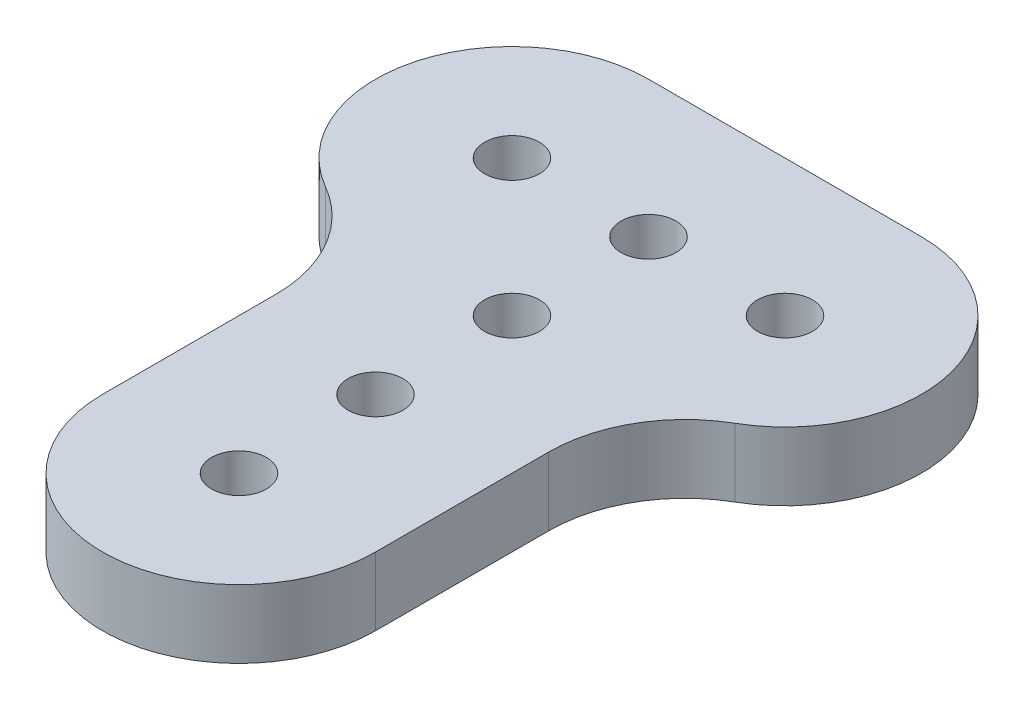
ISO-10303-21;
HEADER;
FILE_DESCRIPTION(('STEP AP214'),'2;1');
FILE_NAME('part.step','',(''),(''),'','','');
FILE_SCHEMA(('AUTOMOTIVE_DESIGN { 1 0 10303 214 1 1 1 1 }'));
ENDSEC;
DATA;
#1=APPLICATION_CONTEXT('core data for automotive mechanical design processes');
#2=APPLICATION_PROTOCOL_DEFINITION('international standard','automotive_design',2000,#1);
#3=PRODUCT_CONTEXT('',#1,'mechanical');
#4=PRODUCT('Part','Part','',(#3));
#5=PRODUCT_RELATED_PRODUCT_CATEGORY('part','',(#4));
#6=PRODUCT_DEFINITION_FORMATION('','',#4);
#7=PRODUCT_DEFINITION_CONTEXT('part definition',#1,'design');
#8=PRODUCT_DEFINITION('design','',#6,#7);
#9=PRODUCT_DEFINITION_SHAPE('','',#8);
#10=(LENGTH_UNIT() NAMED_UNIT(*) SI_UNIT(.MILLI.,.METRE.));
#11=(NAMED_UNIT(*) PLANE_ANGLE_UNIT() SI_UNIT($,.RADIAN.));
#12=(NAMED_UNIT(*) SI_UNIT($,.STERADIAN.) SOLID_ANGLE_UNIT());
#13=UNCERTAINTY_MEASURE_WITH_UNIT(LENGTH_MEASURE(1.E-05),#10,'distance_accuracy_value','');
#14=(GEOMETRIC_REPRESENTATION_CONTEXT(3) GLOBAL_UNCERTAINTY_ASSIGNED_CONTEXT((#13)) GLOBAL_UNIT_ASSIGNED_CONTEXT((#10,
#11,#12)) REPRESENTATION_CONTEXT('',''));
#15=CARTESIAN_POINT('',(0.,0.,0.));
#16=DIRECTION('',(0.,0.,1.));
#17=DIRECTION('',(1.,0.,0.));
#18=AXIS2_PLACEMENT_3D('',#15,#16,#17);
#19=CARTESIAN_POINT('',(38.1,3.175,0.));
#20=DIRECTION('',(0.,-1.,0.));
#21=DIRECTION('',(0.,0.,-1.));
#22=AXIS2_PLACEMENT_3D('',#19,#20,#21);
#23=CYLINDRICAL_SURFACE('',#22,12.7);
#24=CARTESIAN_POINT('',(38.1,3.175,0.));
#25=DIRECTION('',(0.,1.,0.));
#26=DIRECTION('',(0.,0.,1.));
#27=AXIS2_PLACEMENT_3D('',#24,#25,#26);
#28=CIRCLE('',#27,12.7);
#29=CARTESIAN_POINT('',(44.45,3.175,10.9985226280624));
#30=VERTEX_POINT('',#29);
#31=CARTESIAN_POINT('',(38.1,3.175,-12.7));
#32=VERTEX_POINT('',#31);
#33=EDGE_CURVE('E102',#30,#32,#28,.T.);
#34=ORIENTED_EDGE('',*,*,#33,.F.);
#35=DIRECTION('',(0.,-1.,0.));
#36=VECTOR('',#35,1.);
#37=CARTESIAN_POINT('',(44.45,3.175,10.9985226280624));
#38=LINE('',#37,#36);
#39=CARTESIAN_POINT('',(44.45,-3.175,10.9985226280624));
#40=VERTEX_POINT('',#39);
#41=EDGE_CURVE('E195',#30,#40,#38,.T.);
#42=ORIENTED_EDGE('',*,*,#41,.T.);
#43=CARTESIAN_POINT('',(38.1,-3.175,0.));
#44=DIRECTION('',(0.,1.,0.));
#45=DIRECTION('',(0.,0.,1.));
#46=AXIS2_PLACEMENT_3D('',#43,#44,#45);
#47=CIRCLE('',#46,12.7);
#48=CARTESIAN_POINT('',(38.1,-3.175,-12.7));
#49=VERTEX_POINT('',#48);
#50=EDGE_CURVE('E117',#40,#49,#47,.T.);
#51=ORIENTED_EDGE('',*,*,#50,.T.);
#52=DIRECTION('',(0.,-1.,0.));
#53=VECTOR('',#52,1.);
#54=CARTESIAN_POINT('',(38.1,3.175,-12.7));
#55=LINE('',#54,#53);
#56=EDGE_CURVE('E116',#32,#49,#55,.T.);
#57=ORIENTED_EDGE('',*,*,#56,.F.);
#58=EDGE_LOOP('',(#34,#42,#51,#57));
#59=FACE_BOUND('',#58,.T.);
#60=ADVANCED_FACE('F37',(#59),#23,.T.);
#61=CARTESIAN_POINT('',(0.,3.175,-12.7));
#62=DIRECTION('',(0.,0.,-1.));
#63=DIRECTION('',(-1.,0.,0.));
#64=AXIS2_PLACEMENT_3D('',#61,#62,#63);
#65=PLANE('',#64);
#66=DIRECTION('',(1.,0.,0.));
#67=VECTOR('',#66,1.);
#68=CARTESIAN_POINT('',(0.,-3.175,-12.7));
#69=LINE('',#68,#67);
#70=CARTESIAN_POINT('',(12.7,-3.175,-12.7));
#71=VERTEX_POINT('',#70);
#72=EDGE_CURVE('E157',#71,#49,#69,.T.);
#73=ORIENTED_EDGE('',*,*,#72,.F.);
#74=DIRECTION('',(0.,-1.,0.));
#75=VECTOR('',#74,1.);
#76=CARTESIAN_POINT('',(12.7,3.175,-12.7));
#77=LINE('',#76,#75);
#78=CARTESIAN_POINT('',(12.7,3.175,-12.7));
#79=VERTEX_POINT('',#78);
#80=EDGE_CURVE('E122',#79,#71,#77,.T.);
#81=ORIENTED_EDGE('',*,*,#80,.F.);
#82=DIRECTION('',(1.,0.,0.));
#83=VECTOR('',#82,1.);
#84=CARTESIAN_POINT('',(0.,3.175,-12.7));
#85=LINE('',#84,#83);
#86=EDGE_CURVE('E108',#79,#32,#85,.T.);
#87=ORIENTED_EDGE('',*,*,#86,.T.);
#88=ORIENTED_EDGE('',*,*,#56,.T.);
#89=EDGE_LOOP('',(#73,#81,#87,#88));
#90=FACE_BOUND('',#89,.T.);
#91=ADVANCED_FACE('F124',(#90),#65,.T.);
#92=CARTESIAN_POINT('',(12.7,3.175,0.));
#93=DIRECTION('',(0.,-1.,0.));
#94=DIRECTION('',(0.,0.,-1.));
#95=AXIS2_PLACEMENT_3D('',#92,#93,#94);
#96=CYLINDRICAL_SURFACE('',#95,12.7);
#97=CARTESIAN_POINT('',(12.7,-3.175,0.));
#98=DIRECTION('',(0.,1.,0.));
#99=DIRECTION('',(0.,0.,1.));
#100=AXIS2_PLACEMENT_3D('',#97,#98,#99);
#101=CIRCLE('',#100,12.7);
#102=CARTESIAN_POINT('',(6.35,-3.175,10.9985226280624));
#103=VERTEX_POINT('',#102);
#104=EDGE_CURVE('E159',#71,#103,#101,.T.);
#105=ORIENTED_EDGE('',*,*,#104,.T.);
#106=DIRECTION('',(0.,-1.,0.));
#107=VECTOR('',#106,1.);
#108=CARTESIAN_POINT('',(6.35,3.175,10.9985226280624));
#109=LINE('',#108,#107);
#110=CARTESIAN_POINT('',(6.35,3.175,10.9985226280624));
#111=VERTEX_POINT('',#110);
#112=EDGE_CURVE('E193',#103,#111,#109,.F.);
#113=ORIENTED_EDGE('',*,*,#112,.T.);
#114=CARTESIAN_POINT('',(12.7,3.175,0.));
#115=DIRECTION('',(0.,1.,0.));
#116=DIRECTION('',(0.,0.,1.));
#117=AXIS2_PLACEMENT_3D('',#114,#115,#116);
#118=CIRCLE('',#117,12.7);
#119=EDGE_CURVE('E126',#79,#111,#118,.T.);
#120=ORIENTED_EDGE('',*,*,#119,.F.);
#121=ORIENTED_EDGE('',*,*,#80,.T.);
#122=EDGE_LOOP('',(#105,#113,#120,#121));
#123=FACE_BOUND('',#122,.T.);
#124=ADVANCED_FACE('F216',(#123),#96,.T.);
#125=CARTESIAN_POINT('',(12.7,3.175,0.));
#126=DIRECTION('',(-1.,0.,0.));
#127=DIRECTION('',(0.,0.,1.));
#128=AXIS2_PLACEMENT_3D('',#125,#126,#127);
#129=PLANE('',#128);
#130=DIRECTION('',(0.,0.,-1.));
#131=VECTOR('',#130,1.);
#132=CARTESIAN_POINT('',(12.7,3.175,0.));
#133=LINE('',#132,#131);
#134=CARTESIAN_POINT('',(12.7,3.175,38.1));
#135=VERTEX_POINT('',#134);
#136=CARTESIAN_POINT('',(12.7,3.175,21.9970452561247));
#137=VERTEX_POINT('',#136);
#138=EDGE_CURVE('E128',#135,#137,#133,.T.);
#139=ORIENTED_EDGE('',*,*,#138,.T.);
#140=DIRECTION('',(0.,-1.,0.));
#141=VECTOR('',#140,1.);
#142=CARTESIAN_POINT('',(12.7,3.175,21.9970452561247));
#143=LINE('',#142,#141);
#144=CARTESIAN_POINT('',(12.7,-3.175,21.9970452561247));
#145=VERTEX_POINT('',#144);
#146=EDGE_CURVE('E121',#137,#145,#143,.T.);
#147=ORIENTED_EDGE('',*,*,#146,.T.);
#148=DIRECTION('',(0.,0.,-1.));
#149=VECTOR('',#148,1.);
#150=CARTESIAN_POINT('',(12.7,-3.175,0.));
#151=LINE('',#150,#149);
#152=CARTESIAN_POINT('',(12.7,-3.175,38.1));
#153=VERTEX_POINT('',#152);
#154=EDGE_CURVE('E162',#153,#145,#151,.T.);
#155=ORIENTED_EDGE('',*,*,#154,.F.);
#156=DIRECTION('',(0.,-1.,0.));
#157=VECTOR('',#156,1.);
#158=CARTESIAN_POINT('',(12.7,3.175,38.1));
#159=LINE('',#158,#157);
#160=EDGE_CURVE('E188',#135,#153,#159,.T.);
#161=ORIENTED_EDGE('',*,*,#160,.F.);
#162=EDGE_LOOP('',(#139,#147,#155,#161));
#163=FACE_BOUND('',#162,.T.);
#164=ADVANCED_FACE('F207',(#163),#129,.T.);
#165=CARTESIAN_POINT('',(25.4000000000005,3.175,38.1));
#166=DIRECTION('',(0.,-1.,0.));
#167=DIRECTION('',(0.,0.,-1.));
#168=AXIS2_PLACEMENT_3D('',#165,#166,#167);
#169=CYLINDRICAL_SURFACE('',#168,12.7);
#170=CARTESIAN_POINT('',(25.4000000000005,-3.175,38.1));
#171=DIRECTION('',(0.,1.,0.));
#172=DIRECTION('',(0.,0.,1.));
#173=AXIS2_PLACEMENT_3D('',#170,#171,#172);
#174=CIRCLE('',#173,12.7);
#175=CARTESIAN_POINT('',(38.1,-3.175,38.1));
#176=VERTEX_POINT('',#175);
#177=EDGE_CURVE('E165',#153,#176,#174,.T.);
#178=ORIENTED_EDGE('',*,*,#177,.T.);
#179=DIRECTION('',(0.,-1.,0.));
#180=VECTOR('',#179,1.);
#181=CARTESIAN_POINT('',(38.1,3.175,38.1));
#182=LINE('',#181,#180);
#183=CARTESIAN_POINT('',(38.1,3.175,38.1));
#184=VERTEX_POINT('',#183);
#185=EDGE_CURVE('E155',#184,#176,#182,.T.);
#186=ORIENTED_EDGE('',*,*,#185,.F.);
#187=CARTESIAN_POINT('',(25.4000000000005,3.175,38.1));
#188=DIRECTION('',(0.,1.,0.));
#189=DIRECTION('',(0.,0.,1.));
#190=AXIS2_PLACEMENT_3D('',#187,#188,#189);
#191=CIRCLE('',#190,12.7);
#192=EDGE_CURVE('E133',#135,#184,#191,.T.);
#193=ORIENTED_EDGE('',*,*,#192,.F.);
#194=ORIENTED_EDGE('',*,*,#160,.T.);
#195=EDGE_LOOP('',(#178,#186,#193,#194));
#196=FACE_BOUND('',#195,.T.);
#197=ADVANCED_FACE('F223',(#196),#169,.T.);
#198=CARTESIAN_POINT('',(25.4000000000003,3.175,25.4));
#199=DIRECTION('',(0.,-1.,0.));
#200=DIRECTION('',(0.,0.,-1.));
#201=AXIS2_PLACEMENT_3D('',#198,#199,#200);
#202=CYLINDRICAL_SURFACE('',#201,2.5527);
#203=CARTESIAN_POINT('',(25.4000000000003,3.175,25.4));
#204=DIRECTION('',(0.,1.,0.));
#205=DIRECTION('',(0.,0.,1.));
#206=AXIS2_PLACEMENT_3D('',#203,#204,#205);
#207=CIRCLE('',#206,2.5527);
#208=CARTESIAN_POINT('',(25.4000000000003,3.175,27.9527));
#209=VERTEX_POINT('',#208);
#210=EDGE_CURVE('E149',#209,#209,#207,.T.);
#211=ORIENTED_EDGE('',*,*,#210,.T.);
#212=EDGE_LOOP('',(#211));
#213=FACE_BOUND('',#212,.T.);
#214=CARTESIAN_POINT('',(25.4000000000003,-3.175,25.4));
#215=DIRECTION('',(0.,1.,0.));
#216=DIRECTION('',(0.,0.,1.));
#217=AXIS2_PLACEMENT_3D('',#214,#215,#216);
#218=CIRCLE('',#217,2.5527);
#219=CARTESIAN_POINT('',(25.4000000000003,-3.175,27.9527));
#220=VERTEX_POINT('',#219);
#221=EDGE_CURVE('E181',#220,#220,#218,.T.);
#222=ORIENTED_EDGE('',*,*,#221,.F.);
#223=EDGE_LOOP('',(#222));
#224=FACE_BOUND('',#223,.T.);
#225=ADVANCED_FACE('F247',(#213,#224),#202,.F.);
#226=CARTESIAN_POINT('',(25.4,3.175,0.));
#227=DIRECTION('',(0.,-1.,0.));
#228=DIRECTION('',(0.,0.,-1.));
#229=AXIS2_PLACEMENT_3D('',#226,#227,#228);
#230=CYLINDRICAL_SURFACE('',#229,2.5527);
#231=CARTESIAN_POINT('',(25.4,3.175,0.));
#232=DIRECTION('',(0.,1.,0.));
#233=DIRECTION('',(0.,0.,1.));
#234=AXIS2_PLACEMENT_3D('',#231,#232,#233);
#235=CIRCLE('',#234,2.5527);
#236=CARTESIAN_POINT('',(25.4,3.175,2.5527));
#237=VERTEX_POINT('',#236);
#238=EDGE_CURVE('E146',#237,#237,#235,.T.);
#239=ORIENTED_EDGE('',*,*,#238,.T.);
#240=EDGE_LOOP('',(#239));
#241=FACE_BOUND('',#240,.T.);
#242=CARTESIAN_POINT('',(25.4,-3.175,0.));
#243=DIRECTION('',(0.,1.,0.));
#244=DIRECTION('',(0.,0.,1.));
#245=AXIS2_PLACEMENT_3D('',#242,#243,#244);
#246=CIRCLE('',#245,2.5527);
#247=CARTESIAN_POINT('',(25.4,-3.175,2.5527));
#248=VERTEX_POINT('',#247);
#249=EDGE_CURVE('E178',#248,#248,#246,.T.);
#250=ORIENTED_EDGE('',*,*,#249,.F.);
#251=EDGE_LOOP('',(#250));
#252=FACE_BOUND('',#251,.T.);
#253=ADVANCED_FACE('F250',(#241,#252),#230,.F.);
#254=CARTESIAN_POINT('',(38.1,3.175,0.));
#255=DIRECTION('',(0.,-1.,0.));
#256=DIRECTION('',(0.,0.,-1.));
#257=AXIS2_PLACEMENT_3D('',#254,#255,#256);
#258=CYLINDRICAL_SURFACE('',#257,2.5527);
#259=CARTESIAN_POINT('',(38.1,3.175,0.));
#260=DIRECTION('',(0.,1.,0.));
#261=DIRECTION('',(0.,0.,1.));
#262=AXIS2_PLACEMENT_3D('',#259,#260,#261);
#263=CIRCLE('',#262,2.5527);
#264=CARTESIAN_POINT('',(38.1,3.175,2.5527));
#265=VERTEX_POINT('',#264);
#266=EDGE_CURVE('E143',#265,#265,#263,.T.);
#267=ORIENTED_EDGE('',*,*,#266,.T.);
#268=EDGE_LOOP('',(#267));
#269=FACE_BOUND('',#268,.T.);
#270=CARTESIAN_POINT('',(38.1,-3.175,0.));
#271=DIRECTION('',(0.,1.,0.));
#272=DIRECTION('',(0.,0.,1.));
#273=AXIS2_PLACEMENT_3D('',#270,#271,#272);
#274=CIRCLE('',#273,2.5527);
#275=CARTESIAN_POINT('',(38.1,-3.175,2.5527));
#276=VERTEX_POINT('',#275);
#277=EDGE_CURVE('E175',#276,#276,#274,.T.);
#278=ORIENTED_EDGE('',*,*,#277,.F.);
#279=EDGE_LOOP('',(#278));
#280=FACE_BOUND('',#279,.T.);
#281=ADVANCED_FACE('F254',(#269,#280),#258,.F.);
#282=CARTESIAN_POINT('',(12.7,3.175,0.));
#283=DIRECTION('',(0.,-1.,0.));
#284=DIRECTION('',(0.,0.,-1.));
#285=AXIS2_PLACEMENT_3D('',#282,#283,#284);
#286=CYLINDRICAL_SURFACE('',#285,2.5527);
#287=CARTESIAN_POINT('',(12.7,3.175,0.));
#288=DIRECTION('',(0.,1.,0.));
#289=DIRECTION('',(0.,0.,1.));
#290=AXIS2_PLACEMENT_3D('',#287,#288,#289);
#291=CIRCLE('',#290,2.5527);
#292=CARTESIAN_POINT('',(12.7,3.175,2.5527));
#293=VERTEX_POINT('',#292);
#294=EDGE_CURVE('E140',#293,#293,#291,.T.);
#295=ORIENTED_EDGE('',*,*,#294,.T.);
#296=EDGE_LOOP('',(#295));
#297=FACE_BOUND('',#296,.T.);
#298=CARTESIAN_POINT('',(12.7,-3.175,0.));
#299=DIRECTION('',(0.,1.,0.));
#300=DIRECTION('',(0.,0.,1.));
#301=AXIS2_PLACEMENT_3D('',#298,#299,#300);
#302=CIRCLE('',#301,2.5527);
#303=CARTESIAN_POINT('',(12.7,-3.175,2.5527));
#304=VERTEX_POINT('',#303);
#305=EDGE_CURVE('E172',#304,#304,#302,.T.);
#306=ORIENTED_EDGE('',*,*,#305,.F.);
#307=EDGE_LOOP('',(#306));
#308=FACE_BOUND('',#307,.T.);
#309=ADVANCED_FACE('F258',(#297,#308),#286,.F.);
#310=CARTESIAN_POINT('',(25.4000000000001,3.175,12.7));
#311=DIRECTION('',(0.,-1.,0.));
#312=DIRECTION('',(0.,0.,-1.));
#313=AXIS2_PLACEMENT_3D('',#310,#311,#312);
#314=CYLINDRICAL_SURFACE('',#313,2.5527);
#315=CARTESIAN_POINT('',(25.4000000000001,3.175,12.7));
#316=DIRECTION('',(0.,1.,0.));
#317=DIRECTION('',(0.,0.,1.));
#318=AXIS2_PLACEMENT_3D('',#315,#316,#317);
#319=CIRCLE('',#318,2.5527);
#320=CARTESIAN_POINT('',(25.4000000000001,3.175,15.2527));
#321=VERTEX_POINT('',#320);
#322=EDGE_CURVE('E137',#321,#321,#319,.T.);
#323=ORIENTED_EDGE('',*,*,#322,.T.);
#324=EDGE_LOOP('',(#323));
#325=FACE_BOUND('',#324,.T.);
#326=CARTESIAN_POINT('',(25.4000000000001,-3.175,12.7));
#327=DIRECTION('',(0.,1.,0.));
#328=DIRECTION('',(0.,0.,1.));
#329=AXIS2_PLACEMENT_3D('',#326,#327,#328);
#330=CIRCLE('',#329,2.5527);
#331=CARTESIAN_POINT('',(25.4000000000001,-3.175,15.2527));
#332=VERTEX_POINT('',#331);
#333=EDGE_CURVE('E169',#332,#332,#330,.T.);
#334=ORIENTED_EDGE('',*,*,#333,.F.);
#335=EDGE_LOOP('',(#334));
#336=FACE_BOUND('',#335,.T.);
#337=ADVANCED_FACE('F262',(#325,#336),#314,.F.);
#338=CARTESIAN_POINT('',(38.1,3.175,0.));
#339=DIRECTION('',(-1.,0.,0.));
#340=DIRECTION('',(0.,0.,1.));
#341=AXIS2_PLACEMENT_3D('',#338,#339,#340);
#342=PLANE('',#341);
#343=DIRECTION('',(0.,0.,-1.));
#344=VECTOR('',#343,1.);
#345=CARTESIAN_POINT('',(38.1,-3.175,0.));
#346=LINE('',#345,#344);
#347=CARTESIAN_POINT('',(38.1,-3.175,21.9970452561247));
#348=VERTEX_POINT('',#347);
#349=EDGE_CURVE('E167',#176,#348,#346,.T.);
#350=ORIENTED_EDGE('',*,*,#349,.T.);
#351=DIRECTION('',(0.,1.,0.));
#352=VECTOR('',#351,1.);
#353=CARTESIAN_POINT('',(38.1,3.175,21.9970452561247));
#354=LINE('',#353,#352);
#355=CARTESIAN_POINT('',(38.1,3.175,21.9970452561247));
#356=VERTEX_POINT('',#355);
#357=EDGE_CURVE('E52',#348,#356,#354,.T.);
#358=ORIENTED_EDGE('',*,*,#357,.T.);
#359=DIRECTION('',(0.,0.,-1.));
#360=VECTOR('',#359,1.);
#361=CARTESIAN_POINT('',(38.1,3.175,0.));
#362=LINE('',#361,#360);
#363=EDGE_CURVE('E135',#184,#356,#362,.T.);
#364=ORIENTED_EDGE('',*,*,#363,.F.);
#365=ORIENTED_EDGE('',*,*,#185,.T.);
#366=EDGE_LOOP('',(#350,#358,#364,#365));
#367=FACE_BOUND('',#366,.T.);
#368=ADVANCED_FACE('F245',(#367),#342,.F.);
#369=CARTESIAN_POINT('',(25.4000000000004,3.175,38.1));
#370=DIRECTION('',(0.,-1.,0.));
#371=DIRECTION('',(0.,0.,-1.));
#372=AXIS2_PLACEMENT_3D('',#369,#370,#371);
#373=CYLINDRICAL_SURFACE('',#372,2.5527);
#374=CARTESIAN_POINT('',(25.4000000000004,3.175,38.1));
#375=DIRECTION('',(0.,1.,0.));
#376=DIRECTION('',(0.,0.,1.));
#377=AXIS2_PLACEMENT_3D('',#374,#375,#376);
#378=CIRCLE('',#377,2.5527);
#379=CARTESIAN_POINT('',(25.4000000000004,3.175,40.6527));
#380=VERTEX_POINT('',#379);
#381=EDGE_CURVE('E152',#380,#380,#378,.T.);
#382=ORIENTED_EDGE('',*,*,#381,.T.);
#383=EDGE_LOOP('',(#382));
#384=FACE_BOUND('',#383,.T.);
#385=CARTESIAN_POINT('',(25.4000000000004,-3.175,38.1));
#386=DIRECTION('',(0.,1.,0.));
#387=DIRECTION('',(0.,0.,1.));
#388=AXIS2_PLACEMENT_3D('',#385,#386,#387);
#389=CIRCLE('',#388,2.5527);
#390=CARTESIAN_POINT('',(25.4000000000004,-3.175,40.6527));
#391=VERTEX_POINT('',#390);
#392=EDGE_CURVE('E113',#391,#391,#389,.T.);
#393=ORIENTED_EDGE('',*,*,#392,.F.);
#394=EDGE_LOOP('',(#393));
#395=FACE_BOUND('',#394,.T.);
#396=ADVANCED_FACE('F240',(#384,#395),#373,.F.);
#397=CARTESIAN_POINT('',(0.,3.175,0.));
#398=DIRECTION('',(0.,1.,0.));
#399=DIRECTION('',(0.,0.,1.));
#400=AXIS2_PLACEMENT_3D('',#397,#398,#399);
#401=PLANE('',#400);
#402=ORIENTED_EDGE('',*,*,#363,.T.);
#403=CARTESIAN_POINT('',(50.8,3.175,21.9970452561247));
#404=DIRECTION('',(0.,1.,0.));
#405=DIRECTION('',(0.,0.,1.));
#406=AXIS2_PLACEMENT_3D('',#403,#404,#405);
#407=CIRCLE('',#406,12.7);
#408=EDGE_CURVE('E11',#356,#30,#407,.F.);
#409=ORIENTED_EDGE('',*,*,#408,.T.);
#410=ORIENTED_EDGE('',*,*,#33,.T.);
#411=ORIENTED_EDGE('',*,*,#86,.F.);
#412=ORIENTED_EDGE('',*,*,#119,.T.);
#413=CARTESIAN_POINT('',(0.,3.175,21.9970452561247));
#414=DIRECTION('',(0.,1.,0.));
#415=DIRECTION('',(0.,0.,1.));
#416=AXIS2_PLACEMENT_3D('',#413,#414,#415);
#417=CIRCLE('',#416,12.7);
#418=EDGE_CURVE('E200',#111,#137,#417,.F.);
#419=ORIENTED_EDGE('',*,*,#418,.T.);
#420=ORIENTED_EDGE('',*,*,#138,.F.);
#421=ORIENTED_EDGE('',*,*,#192,.T.);
#422=EDGE_LOOP('',(#402,#409,#410,#411,#412,#419,#420,#421));
#423=FACE_BOUND('',#422,.T.);
#424=ORIENTED_EDGE('',*,*,#322,.F.);
#425=EDGE_LOOP('',(#424));
#426=FACE_BOUND('',#425,.T.);
#427=ORIENTED_EDGE('',*,*,#294,.F.);
#428=EDGE_LOOP('',(#427));
#429=FACE_BOUND('',#428,.T.);
#430=ORIENTED_EDGE('',*,*,#266,.F.);
#431=EDGE_LOOP('',(#430));
#432=FACE_BOUND('',#431,.T.);
#433=ORIENTED_EDGE('',*,*,#238,.F.);
#434=EDGE_LOOP('',(#433));
#435=FACE_BOUND('',#434,.T.);
#436=ORIENTED_EDGE('',*,*,#210,.F.);
#437=EDGE_LOOP('',(#436));
#438=FACE_BOUND('',#437,.T.);
#439=ORIENTED_EDGE('',*,*,#381,.F.);
#440=EDGE_LOOP('',(#439));
#441=FACE_BOUND('',#440,.T.);
#442=ADVANCED_FACE('F104',(#423,#426,#429,#432,#435,#438,#441),#401,.T.);
#443=CARTESIAN_POINT('',(0.,-3.175,0.));
#444=DIRECTION('',(0.,1.,0.));
#445=DIRECTION('',(0.,0.,1.));
#446=AXIS2_PLACEMENT_3D('',#443,#444,#445);
#447=PLANE('',#446);
#448=ORIENTED_EDGE('',*,*,#50,.F.);
#449=CARTESIAN_POINT('',(50.8,-3.175,21.9970452561247));
#450=DIRECTION('',(0.,1.,0.));
#451=DIRECTION('',(0.,0.,1.));
#452=AXIS2_PLACEMENT_3D('',#449,#450,#451);
#453=CIRCLE('',#452,12.7);
#454=EDGE_CURVE('E45',#40,#348,#453,.T.);
#455=ORIENTED_EDGE('',*,*,#454,.T.);
#456=ORIENTED_EDGE('',*,*,#349,.F.);
#457=ORIENTED_EDGE('',*,*,#177,.F.);
#458=ORIENTED_EDGE('',*,*,#154,.T.);
#459=CARTESIAN_POINT('',(0.,-3.175,21.9970452561247));
#460=DIRECTION('',(0.,1.,0.));
#461=DIRECTION('',(0.,0.,1.));
#462=AXIS2_PLACEMENT_3D('',#459,#460,#461);
#463=CIRCLE('',#462,12.7);
#464=EDGE_CURVE('E198',#145,#103,#463,.T.);
#465=ORIENTED_EDGE('',*,*,#464,.T.);
#466=ORIENTED_EDGE('',*,*,#104,.F.);
#467=ORIENTED_EDGE('',*,*,#72,.T.);
#468=EDGE_LOOP('',(#448,#455,#456,#457,#458,#465,#466,#467));
#469=FACE_BOUND('',#468,.T.);
#470=ORIENTED_EDGE('',*,*,#333,.T.);
#471=EDGE_LOOP('',(#470));
#472=FACE_BOUND('',#471,.T.);
#473=ORIENTED_EDGE('',*,*,#305,.T.);
#474=EDGE_LOOP('',(#473));
#475=FACE_BOUND('',#474,.T.);
#476=ORIENTED_EDGE('',*,*,#277,.T.);
#477=EDGE_LOOP('',(#476));
#478=FACE_BOUND('',#477,.T.);
#479=ORIENTED_EDGE('',*,*,#249,.T.);
#480=EDGE_LOOP('',(#479));
#481=FACE_BOUND('',#480,.T.);
#482=ORIENTED_EDGE('',*,*,#221,.T.);
#483=EDGE_LOOP('',(#482));
#484=FACE_BOUND('',#483,.T.);
#485=ORIENTED_EDGE('',*,*,#392,.T.);
#486=EDGE_LOOP('',(#485));
#487=FACE_BOUND('',#486,.T.);
#488=ADVANCED_FACE('F212',(#469,#472,#475,#478,#481,#484,#487),#447,.F.);
#489=CARTESIAN_POINT('',(0.,3.175,21.9970452561247));
#490=DIRECTION('',(0.,-1.,0.));
#491=DIRECTION('',(0.,0.,-1.));
#492=AXIS2_PLACEMENT_3D('',#489,#490,#491);
#493=CYLINDRICAL_SURFACE('',#492,12.7);
#494=ORIENTED_EDGE('',*,*,#418,.F.);
#495=ORIENTED_EDGE('',*,*,#112,.F.);
#496=ORIENTED_EDGE('',*,*,#464,.F.);
#497=ORIENTED_EDGE('',*,*,#146,.F.);
#498=EDGE_LOOP('',(#494,#495,#496,#497));
#499=FACE_BOUND('',#498,.T.);
#500=ADVANCED_FACE('F210',(#499),#493,.F.);
#501=CARTESIAN_POINT('',(50.8,3.175,21.9970452561247));
#502=DIRECTION('',(0.,-1.,0.));
#503=DIRECTION('',(0.,0.,-1.));
#504=AXIS2_PLACEMENT_3D('',#501,#502,#503);
#505=CYLINDRICAL_SURFACE('',#504,12.7);
#506=ORIENTED_EDGE('',*,*,#408,.F.);
#507=ORIENTED_EDGE('',*,*,#357,.F.);
#508=ORIENTED_EDGE('',*,*,#454,.F.);
#509=ORIENTED_EDGE('',*,*,#41,.F.);
#510=EDGE_LOOP('',(#506,#507,#508,#509));
#511=FACE_BOUND('',#510,.T.);
#512=ADVANCED_FACE('F39',(#511),#505,.F.);
#513=CLOSED_SHELL('',(#60,#91,#124,#164,#197,#225,#253,#281,#309,#337,#368,#396,#442,#488,#500,#512));
#514=MANIFOLD_SOLID_BREP('B2',#513);
#515=ADVANCED_BREP_SHAPE_REPRESENTATION('',(#18,#514),#14);
#516=SHAPE_DEFINITION_REPRESENTATION(#9,#515);
ENDSEC;
END-ISO-10303-21;
